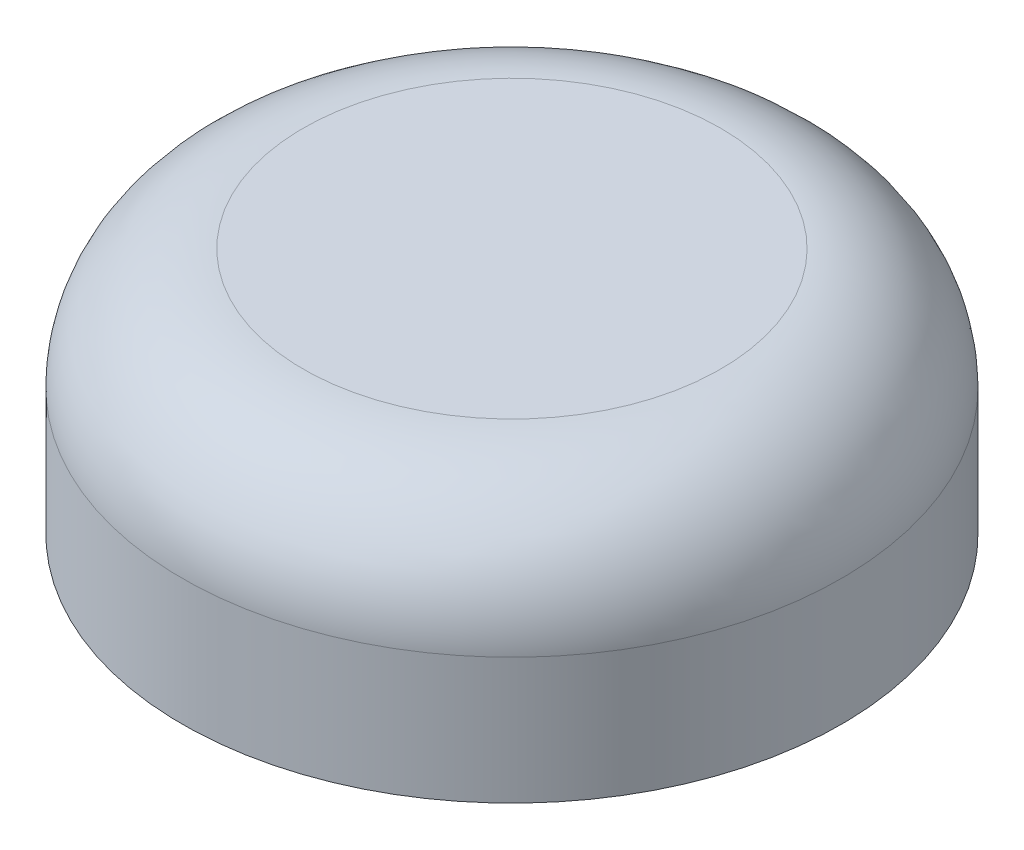
ISO-10303-21;
HEADER;
FILE_DESCRIPTION(('STEP AP214'),'2;1');
FILE_NAME('part.step','',(''),(''),'','','');
FILE_SCHEMA(('AUTOMOTIVE_DESIGN { 1 0 10303 214 1 1 1 1 }'));
ENDSEC;
DATA;
#1=APPLICATION_CONTEXT('core data for automotive mechanical design processes');
#2=APPLICATION_PROTOCOL_DEFINITION('international standard','automotive_design',2000,#1);
#3=PRODUCT_CONTEXT('',#1,'mechanical');
#4=PRODUCT('Part','Part','',(#3));
#5=PRODUCT_RELATED_PRODUCT_CATEGORY('part','',(#4));
#6=PRODUCT_DEFINITION_FORMATION('','',#4);
#7=PRODUCT_DEFINITION_CONTEXT('part definition',#1,'design');
#8=PRODUCT_DEFINITION('design','',#6,#7);
#9=PRODUCT_DEFINITION_SHAPE('','',#8);
#10=(LENGTH_UNIT() NAMED_UNIT(*) SI_UNIT(.MILLI.,.METRE.));
#11=(NAMED_UNIT(*) PLANE_ANGLE_UNIT() SI_UNIT($,.RADIAN.));
#12=(NAMED_UNIT(*) SI_UNIT($,.STERADIAN.) SOLID_ANGLE_UNIT());
#13=UNCERTAINTY_MEASURE_WITH_UNIT(LENGTH_MEASURE(1.E-05),#10,'distance_accuracy_value','');
#14=(GEOMETRIC_REPRESENTATION_CONTEXT(3) GLOBAL_UNCERTAINTY_ASSIGNED_CONTEXT((#13)) GLOBAL_UNIT_ASSIGNED_CONTEXT((#10,
#11,#12)) REPRESENTATION_CONTEXT('',''));
#15=CARTESIAN_POINT('',(0.,0.,0.));
#16=DIRECTION('',(0.,0.,1.));
#17=DIRECTION('',(1.,0.,0.));
#18=AXIS2_PLACEMENT_3D('',#15,#16,#17);
#19=CARTESIAN_POINT('',(0.,5.08,0.));
#20=DIRECTION('',(0.,-1.,0.));
#21=DIRECTION('',(0.,0.,-1.));
#22=AXIS2_PLACEMENT_3D('',#19,#20,#21);
#23=PLANE('',#22);
#24=CARTESIAN_POINT('',(0.,5.08,0.));
#25=DIRECTION('',(0.,-1.,0.));
#26=DIRECTION('',(0.,0.,-1.));
#27=AXIS2_PLACEMENT_3D('',#24,#25,#26);
#28=CIRCLE('',#27,24.13);
#29=CARTESIAN_POINT('',(0.,5.08,-24.13));
#30=VERTEX_POINT('',#29);
#31=EDGE_CURVE('E10',#30,#30,#28,.T.);
#32=ORIENTED_EDGE('',*,*,#31,.F.);
#33=EDGE_LOOP('',(#32));
#34=FACE_BOUND('',#33,.T.);
#35=ADVANCED_FACE('F30',(#34),#23,.F.);
#36=CARTESIAN_POINT('',(0.,-8.89,0.));
#37=DIRECTION('',(0.,-1.,0.));
#38=DIRECTION('',(0.,0.,-1.));
#39=AXIS2_PLACEMENT_3D('',#36,#37,#38);
#40=TOROIDAL_SURFACE('',#39,24.13,13.97);
#41=CARTESIAN_POINT('',(0.,-8.89,0.));
#42=DIRECTION('',(0.,-1.,0.));
#43=DIRECTION('',(0.,0.,-1.));
#44=AXIS2_PLACEMENT_3D('',#41,#42,#43);
#45=CIRCLE('',#44,38.1);
#46=CARTESIAN_POINT('',(0.,-8.89,-38.1));
#47=VERTEX_POINT('',#46);
#48=EDGE_CURVE('E36',#47,#47,#45,.T.);
#49=ORIENTED_EDGE('',*,*,#48,.F.);
#50=EDGE_LOOP('',(#49));
#51=FACE_BOUND('',#50,.T.);
#52=ORIENTED_EDGE('',*,*,#31,.T.);
#53=EDGE_LOOP('',(#52));
#54=FACE_BOUND('',#53,.T.);
#55=ADVANCED_FACE('F96',(#51,#54),#40,.T.);
#56=CARTESIAN_POINT('',(0.,0.,0.));
#57=DIRECTION('',(0.,-1.,0.));
#58=DIRECTION('',(0.,0.,-1.));
#59=AXIS2_PLACEMENT_3D('',#56,#57,#58);
#60=CYLINDRICAL_SURFACE('',#59,38.1);
#61=CARTESIAN_POINT('',(0.,-23.495,0.));
#62=DIRECTION('',(0.,-1.,0.));
#63=DIRECTION('',(0.,0.,-1.));
#64=AXIS2_PLACEMENT_3D('',#61,#62,#63);
#65=CIRCLE('',#64,38.1);
#66=CARTESIAN_POINT('',(0.,-23.495,-38.1));
#67=VERTEX_POINT('',#66);
#68=EDGE_CURVE('E40',#67,#67,#65,.T.);
#69=ORIENTED_EDGE('',*,*,#68,.F.);
#70=EDGE_LOOP('',(#69));
#71=FACE_BOUND('',#70,.T.);
#72=ORIENTED_EDGE('',*,*,#48,.T.);
#73=EDGE_LOOP('',(#72));
#74=FACE_BOUND('',#73,.T.);
#75=ADVANCED_FACE('F91',(#71,#74),#60,.T.);
#76=CARTESIAN_POINT('',(-35.56,-23.495,0.));
#77=DIRECTION('',(0.,1.,0.));
#78=DIRECTION('',(0.,0.,1.));
#79=AXIS2_PLACEMENT_3D('',#76,#77,#78);
#80=PLANE('',#79);
#81=CARTESIAN_POINT('',(0.,-23.495,0.));
#82=DIRECTION('',(0.,-1.,0.));
#83=DIRECTION('',(0.,0.,-1.));
#84=AXIS2_PLACEMENT_3D('',#81,#82,#83);
#85=CIRCLE('',#84,35.56);
#86=CARTESIAN_POINT('',(0.,-23.495,-35.56));
#87=VERTEX_POINT('',#86);
#88=EDGE_CURVE('E44',#87,#87,#85,.T.);
#89=ORIENTED_EDGE('',*,*,#88,.F.);
#90=EDGE_LOOP('',(#89));
#91=FACE_BOUND('',#90,.T.);
#92=ORIENTED_EDGE('',*,*,#68,.T.);
#93=EDGE_LOOP('',(#92));
#94=FACE_BOUND('',#93,.T.);
#95=ADVANCED_FACE('F85',(#91,#94),#80,.F.);
#96=CARTESIAN_POINT('',(0.,0.,0.));
#97=DIRECTION('',(0.,-1.,0.));
#98=DIRECTION('',(0.,0.,-1.));
#99=AXIS2_PLACEMENT_3D('',#96,#97,#98);
#100=CYLINDRICAL_SURFACE('',#99,35.56);
#101=CARTESIAN_POINT('',(0.,-10.795,0.));
#102=DIRECTION('',(0.,-1.,0.));
#103=DIRECTION('',(0.,0.,-1.));
#104=AXIS2_PLACEMENT_3D('',#101,#102,#103);
#105=CIRCLE('',#104,35.56);
#106=CARTESIAN_POINT('',(0.,-10.795,-35.56));
#107=VERTEX_POINT('',#106);
#108=EDGE_CURVE('E49',#107,#107,#105,.T.);
#109=ORIENTED_EDGE('',*,*,#108,.F.);
#110=EDGE_LOOP('',(#109));
#111=FACE_BOUND('',#110,.T.);
#112=ORIENTED_EDGE('',*,*,#88,.T.);
#113=EDGE_LOOP('',(#112));
#114=FACE_BOUND('',#113,.T.);
#115=ADVANCED_FACE('F79',(#111,#114),#100,.F.);
#116=CARTESIAN_POINT('',(-33.02,-10.795,0.));
#117=DIRECTION('',(0.,1.,0.));
#118=DIRECTION('',(0.,0.,1.));
#119=AXIS2_PLACEMENT_3D('',#116,#117,#118);
#120=PLANE('',#119);
#121=CARTESIAN_POINT('',(0.,-10.795,0.));
#122=DIRECTION('',(0.,-1.,0.));
#123=DIRECTION('',(0.,0.,-1.));
#124=AXIS2_PLACEMENT_3D('',#121,#122,#123);
#125=CIRCLE('',#124,33.02);
#126=CARTESIAN_POINT('',(0.,-10.795,-33.02));
#127=VERTEX_POINT('',#126);
#128=EDGE_CURVE('E52',#127,#127,#125,.T.);
#129=ORIENTED_EDGE('',*,*,#128,.F.);
#130=EDGE_LOOP('',(#129));
#131=FACE_BOUND('',#130,.T.);
#132=ORIENTED_EDGE('',*,*,#108,.T.);
#133=EDGE_LOOP('',(#132));
#134=FACE_BOUND('',#133,.T.);
#135=ADVANCED_FACE('F73',(#131,#134),#120,.F.);
#136=CARTESIAN_POINT('',(0.,0.,0.));
#137=DIRECTION('',(0.,-1.,0.));
#138=DIRECTION('',(0.,0.,-1.));
#139=AXIS2_PLACEMENT_3D('',#136,#137,#138);
#140=CYLINDRICAL_SURFACE('',#139,33.02);
#141=CARTESIAN_POINT('',(0.,-8.89,0.));
#142=DIRECTION('',(0.,-1.,0.));
#143=DIRECTION('',(0.,0.,-1.));
#144=AXIS2_PLACEMENT_3D('',#141,#142,#143);
#145=CIRCLE('',#144,33.02);
#146=CARTESIAN_POINT('',(0.,-8.89,-33.02));
#147=VERTEX_POINT('',#146);
#148=EDGE_CURVE('E55',#147,#147,#145,.T.);
#149=ORIENTED_EDGE('',*,*,#148,.F.);
#150=EDGE_LOOP('',(#149));
#151=FACE_BOUND('',#150,.T.);
#152=ORIENTED_EDGE('',*,*,#128,.T.);
#153=EDGE_LOOP('',(#152));
#154=FACE_BOUND('',#153,.T.);
#155=ADVANCED_FACE('F67',(#151,#154),#140,.F.);
#156=CARTESIAN_POINT('',(0.,-8.89,0.));
#157=DIRECTION('',(0.,-1.,0.));
#158=DIRECTION('',(0.,0.,-1.));
#159=AXIS2_PLACEMENT_3D('',#156,#157,#158);
#160=TOROIDAL_SURFACE('',#159,24.13,8.89);
#161=CARTESIAN_POINT('',(0.,0.,0.));
#162=DIRECTION('',(0.,-1.,0.));
#163=DIRECTION('',(0.,0.,-1.));
#164=AXIS2_PLACEMENT_3D('',#161,#162,#163);
#165=CIRCLE('',#164,24.13);
#166=CARTESIAN_POINT('',(0.,0.,-24.13));
#167=VERTEX_POINT('',#166);
#168=EDGE_CURVE('E58',#167,#167,#165,.T.);
#169=ORIENTED_EDGE('',*,*,#168,.F.);
#170=EDGE_LOOP('',(#169));
#171=FACE_BOUND('',#170,.T.);
#172=ORIENTED_EDGE('',*,*,#148,.T.);
#173=EDGE_LOOP('',(#172));
#174=FACE_BOUND('',#173,.T.);
#175=ADVANCED_FACE('F64',(#171,#174),#160,.F.);
#176=CARTESIAN_POINT('',(0.,0.,0.));
#177=DIRECTION('',(0.,1.,0.));
#178=DIRECTION('',(0.,0.,1.));
#179=AXIS2_PLACEMENT_3D('',#176,#177,#178);
#180=PLANE('',#179);
#181=ORIENTED_EDGE('',*,*,#168,.T.);
#182=EDGE_LOOP('',(#181));
#183=FACE_BOUND('',#182,.T.);
#184=ADVANCED_FACE('F62',(#183),#180,.F.);
#185=CLOSED_SHELL('',(#35,#55,#75,#95,#115,#135,#155,#175,#184));
#186=MANIFOLD_SOLID_BREP('B2',#185);
#187=ADVANCED_BREP_SHAPE_REPRESENTATION('',(#18,#186),#14);
#188=SHAPE_DEFINITION_REPRESENTATION(#9,#187);
ENDSEC;
END-ISO-10303-21;
